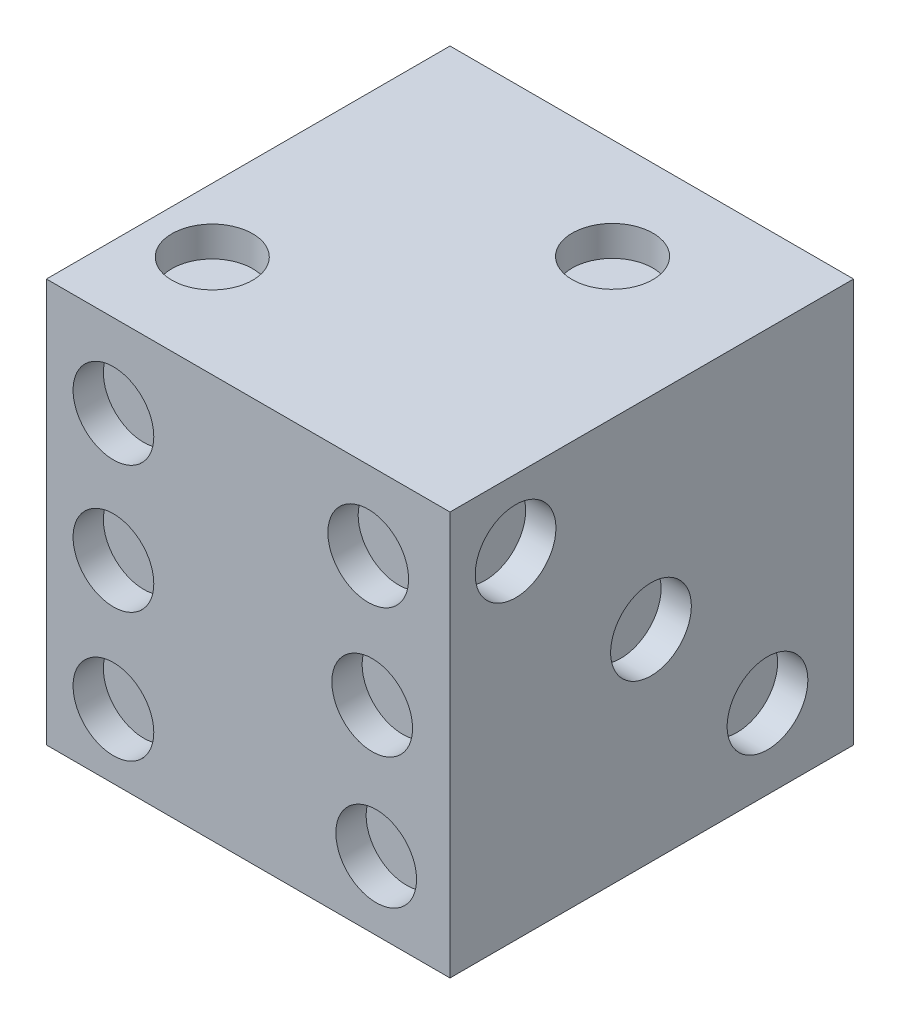
ISO-10303-21;
HEADER;
FILE_DESCRIPTION(('STEP AP214'),'2;1');
FILE_NAME('part.step','',(''),(''),'','','');
FILE_SCHEMA(('AUTOMOTIVE_DESIGN { 1 0 10303 214 1 1 1 1 }'));
ENDSEC;
DATA;
#1=APPLICATION_CONTEXT('core data for automotive mechanical design processes');
#2=APPLICATION_PROTOCOL_DEFINITION('international standard','automotive_design',2000,#1);
#3=PRODUCT_CONTEXT('',#1,'mechanical');
#4=PRODUCT('Part','Part','',(#3));
#5=PRODUCT_RELATED_PRODUCT_CATEGORY('part','',(#4));
#6=PRODUCT_DEFINITION_FORMATION('','',#4);
#7=PRODUCT_DEFINITION_CONTEXT('part definition',#1,'design');
#8=PRODUCT_DEFINITION('design','',#6,#7);
#9=PRODUCT_DEFINITION_SHAPE('','',#8);
#10=(LENGTH_UNIT() NAMED_UNIT(*) SI_UNIT(.MILLI.,.METRE.));
#11=(NAMED_UNIT(*) PLANE_ANGLE_UNIT() SI_UNIT($,.RADIAN.));
#12=(NAMED_UNIT(*) SI_UNIT($,.STERADIAN.) SOLID_ANGLE_UNIT());
#13=UNCERTAINTY_MEASURE_WITH_UNIT(LENGTH_MEASURE(1.E-05),#10,'distance_accuracy_value','');
#14=(GEOMETRIC_REPRESENTATION_CONTEXT(3) GLOBAL_UNCERTAINTY_ASSIGNED_CONTEXT((#13)) GLOBAL_UNIT_ASSIGNED_CONTEXT((#10,
#11,#12)) REPRESENTATION_CONTEXT('',''));
#15=CARTESIAN_POINT('',(0.,0.,0.));
#16=DIRECTION('',(0.,0.,1.));
#17=DIRECTION('',(1.,0.,0.));
#18=AXIS2_PLACEMENT_3D('',#15,#16,#17);
#19=CARTESIAN_POINT('',(-10.,20.,20.));
#20=DIRECTION('',(1.,0.,0.));
#21=DIRECTION('',(0.,0.,-1.));
#22=AXIS2_PLACEMENT_3D('',#19,#20,#21);
#23=PLANE('',#22);
#24=CARTESIAN_POINT('',(-10.,9.47677435584637,10.7372962402579));
#25=DIRECTION('',(-1.,0.,0.));
#26=DIRECTION('',(0.,0.,1.));
#27=AXIS2_PLACEMENT_3D('',#24,#25,#26);
#28=CIRCLE('',#27,2.);
#29=CARTESIAN_POINT('',(-10.,9.47677435584637,12.7372962402579));
#30=VERTEX_POINT('',#29);
#31=EDGE_CURVE('E213',#30,#30,#28,.T.);
#32=ORIENTED_EDGE('',*,*,#31,.F.);
#33=EDGE_LOOP('',(#32));
#34=FACE_BOUND('',#33,.T.);
#35=CARTESIAN_POINT('',(-10.,3.4279190696509,6.50648336929294));
#36=DIRECTION('',(-1.,0.,0.));
#37=DIRECTION('',(0.,0.,1.));
#38=AXIS2_PLACEMENT_3D('',#35,#36,#37);
#39=CIRCLE('',#38,2.);
#40=CARTESIAN_POINT('',(-10.,3.4279190696509,8.50648336929294));
#41=VERTEX_POINT('',#40);
#42=EDGE_CURVE('E208',#41,#41,#39,.T.);
#43=ORIENTED_EDGE('',*,*,#42,.F.);
#44=EDGE_LOOP('',(#43));
#45=FACE_BOUND('',#44,.T.);
#46=CARTESIAN_POINT('',(-10.,15.8511011072449,6.50648336929294));
#47=DIRECTION('',(-1.,0.,0.));
#48=DIRECTION('',(0.,0.,-1.));
#49=AXIS2_PLACEMENT_3D('',#46,#47,#48);
#50=CIRCLE('',#49,2.);
#51=CARTESIAN_POINT('',(-10.,15.8511011072449,4.50648336929294));
#52=VERTEX_POINT('',#51);
#53=EDGE_CURVE('E202',#52,#52,#50,.T.);
#54=ORIENTED_EDGE('',*,*,#53,.F.);
#55=EDGE_LOOP('',(#54));
#56=FACE_BOUND('',#55,.T.);
#57=CARTESIAN_POINT('',(-10.,15.8511011072449,15.6647192184352));
#58=DIRECTION('',(-1.,0.,0.));
#59=DIRECTION('',(0.,0.,-1.));
#60=AXIS2_PLACEMENT_3D('',#57,#58,#59);
#61=CIRCLE('',#60,2.);
#62=CARTESIAN_POINT('',(-10.,15.8511011072449,13.6647192184351));
#63=VERTEX_POINT('',#62);
#64=EDGE_CURVE('E195',#63,#63,#61,.T.);
#65=ORIENTED_EDGE('',*,*,#64,.F.);
#66=EDGE_LOOP('',(#65));
#67=FACE_BOUND('',#66,.T.);
#68=CARTESIAN_POINT('',(-10.,3.4279190696509,15.6647192184352));
#69=DIRECTION('',(-1.,0.,0.));
#70=DIRECTION('',(0.,0.,1.));
#71=AXIS2_PLACEMENT_3D('',#68,#69,#70);
#72=CIRCLE('',#71,2.);
#73=CARTESIAN_POINT('',(-10.,3.4279190696509,17.6647192184352));
#74=VERTEX_POINT('',#73);
#75=EDGE_CURVE('E189',#74,#74,#72,.T.);
#76=ORIENTED_EDGE('',*,*,#75,.F.);
#77=EDGE_LOOP('',(#76));
#78=FACE_BOUND('',#77,.T.);
#79=DIRECTION('',(0.,-1.,0.));
#80=VECTOR('',#79,1.);
#81=CARTESIAN_POINT('',(-10.,20.,0.));
#82=LINE('',#81,#80);
#83=CARTESIAN_POINT('',(-10.,20.,0.));
#84=VERTEX_POINT('',#83);
#85=CARTESIAN_POINT('',(-10.,0.,0.));
#86=VERTEX_POINT('',#85);
#87=EDGE_CURVE('E97',#84,#86,#82,.T.);
#88=ORIENTED_EDGE('',*,*,#87,.T.);
#89=DIRECTION('',(0.,0.,-1.));
#90=VECTOR('',#89,1.);
#91=CARTESIAN_POINT('',(-10.,0.,20.));
#92=LINE('',#91,#90);
#93=CARTESIAN_POINT('',(-10.,0.,20.));
#94=VERTEX_POINT('',#93);
#95=EDGE_CURVE('E11',#94,#86,#92,.T.);
#96=ORIENTED_EDGE('',*,*,#95,.F.);
#97=DIRECTION('',(0.,-1.,0.));
#98=VECTOR('',#97,1.);
#99=CARTESIAN_POINT('',(-10.,20.,20.));
#100=LINE('',#99,#98);
#101=CARTESIAN_POINT('',(-10.,20.,20.));
#102=VERTEX_POINT('',#101);
#103=EDGE_CURVE('E85',#102,#94,#100,.T.);
#104=ORIENTED_EDGE('',*,*,#103,.F.);
#105=DIRECTION('',(0.,0.,-1.));
#106=VECTOR('',#105,1.);
#107=CARTESIAN_POINT('',(-10.,20.,20.));
#108=LINE('',#107,#106);
#109=EDGE_CURVE('E93',#102,#84,#108,.T.);
#110=ORIENTED_EDGE('',*,*,#109,.T.);
#111=EDGE_LOOP('',(#88,#96,#104,#110));
#112=FACE_BOUND('',#111,.T.);
#113=ADVANCED_FACE('F34',(#34,#45,#56,#67,#78,#112),#23,.F.);
#114=CARTESIAN_POINT('',(-10.,0.,20.));
#115=DIRECTION('',(0.,1.,0.));
#116=DIRECTION('',(0.,0.,1.));
#117=AXIS2_PLACEMENT_3D('',#114,#115,#116);
#118=PLANE('',#117);
#119=CARTESIAN_POINT('',(-7.03112357133762,0.,13.2429627983441));
#120=DIRECTION('',(0.,-1.,0.));
#121=DIRECTION('',(0.,0.,-1.));
#122=AXIS2_PLACEMENT_3D('',#119,#120,#121);
#123=CIRCLE('',#122,2.);
#124=CARTESIAN_POINT('',(-7.03112357133762,0.,11.2429627983441));
#125=VERTEX_POINT('',#124);
#126=EDGE_CURVE('E172',#125,#125,#123,.T.);
#127=ORIENTED_EDGE('',*,*,#126,.F.);
#128=EDGE_LOOP('',(#127));
#129=FACE_BOUND('',#128,.T.);
#130=CARTESIAN_POINT('',(7.03112357133762,0.,13.2429627983441));
#131=DIRECTION('',(0.,-1.,0.));
#132=DIRECTION('',(0.,0.,1.));
#133=AXIS2_PLACEMENT_3D('',#130,#131,#132);
#134=CIRCLE('',#133,2.);
#135=CARTESIAN_POINT('',(7.03112357133762,0.,15.2429627983441));
#136=VERTEX_POINT('',#135);
#137=EDGE_CURVE('E166',#136,#136,#134,.T.);
#138=ORIENTED_EDGE('',*,*,#137,.F.);
#139=EDGE_LOOP('',(#138));
#140=FACE_BOUND('',#139,.T.);
#141=CARTESIAN_POINT('',(7.03112357133762,0.,4.4176472301416));
#142=DIRECTION('',(0.,-1.,0.));
#143=DIRECTION('',(0.,0.,1.));
#144=AXIS2_PLACEMENT_3D('',#141,#142,#143);
#145=CIRCLE('',#144,2.);
#146=CARTESIAN_POINT('',(7.03112357133762,0.,6.4176472301416));
#147=VERTEX_POINT('',#146);
#148=EDGE_CURVE('E159',#147,#147,#145,.T.);
#149=ORIENTED_EDGE('',*,*,#148,.F.);
#150=EDGE_LOOP('',(#149));
#151=FACE_BOUND('',#150,.T.);
#152=CARTESIAN_POINT('',(-7.03112357133762,0.,4.4176472301416));
#153=DIRECTION('',(0.,-1.,0.));
#154=DIRECTION('',(0.,0.,-1.));
#155=AXIS2_PLACEMENT_3D('',#152,#153,#154);
#156=CIRCLE('',#155,2.);
#157=CARTESIAN_POINT('',(-7.03112357133762,0.,2.4176472301416));
#158=VERTEX_POINT('',#157);
#159=EDGE_CURVE('E153',#158,#158,#156,.T.);
#160=ORIENTED_EDGE('',*,*,#159,.F.);
#161=EDGE_LOOP('',(#160));
#162=FACE_BOUND('',#161,.T.);
#163=DIRECTION('',(1.,0.,0.));
#164=VECTOR('',#163,1.);
#165=CARTESIAN_POINT('',(-10.,0.,0.));
#166=LINE('',#165,#164);
#167=CARTESIAN_POINT('',(10.,0.,0.));
#168=VERTEX_POINT('',#167);
#169=EDGE_CURVE('E89',#86,#168,#166,.T.);
#170=ORIENTED_EDGE('',*,*,#169,.T.);
#171=DIRECTION('',(0.,0.,-1.));
#172=VECTOR('',#171,1.);
#173=CARTESIAN_POINT('',(10.,0.,20.));
#174=LINE('',#173,#172);
#175=CARTESIAN_POINT('',(10.,0.,20.));
#176=VERTEX_POINT('',#175);
#177=EDGE_CURVE('E42',#176,#168,#174,.T.);
#178=ORIENTED_EDGE('',*,*,#177,.F.);
#179=DIRECTION('',(1.,0.,0.));
#180=VECTOR('',#179,1.);
#181=CARTESIAN_POINT('',(-10.,0.,20.));
#182=LINE('',#181,#180);
#183=EDGE_CURVE('E80',#94,#176,#182,.T.);
#184=ORIENTED_EDGE('',*,*,#183,.F.);
#185=ORIENTED_EDGE('',*,*,#95,.T.);
#186=EDGE_LOOP('',(#170,#178,#184,#185));
#187=FACE_BOUND('',#186,.T.);
#188=ADVANCED_FACE('F88',(#129,#140,#151,#162,#187),#118,.F.);
#189=CARTESIAN_POINT('',(10.,20.,20.));
#190=DIRECTION('',(-1.,0.,0.));
#191=DIRECTION('',(0.,0.,1.));
#192=AXIS2_PLACEMENT_3D('',#189,#190,#191);
#193=PLANE('',#192);
#194=CARTESIAN_POINT('',(10.,9.9860369719682,10.0393947627424));
#195=DIRECTION('',(1.,0.,0.));
#196=DIRECTION('',(0.,0.,-1.));
#197=AXIS2_PLACEMENT_3D('',#194,#195,#196);
#198=CIRCLE('',#197,2.);
#199=CARTESIAN_POINT('',(10.,9.9860369719682,8.0393947627424));
#200=VERTEX_POINT('',#199);
#201=EDGE_CURVE('E231',#200,#200,#198,.T.);
#202=ORIENTED_EDGE('',*,*,#201,.F.);
#203=EDGE_LOOP('',(#202));
#204=FACE_BOUND('',#203,.T.);
#205=CARTESIAN_POINT('',(10.,3.92594478392816,4.26530483262155));
#206=DIRECTION('',(1.,0.,0.));
#207=DIRECTION('',(0.,0.,-1.));
#208=AXIS2_PLACEMENT_3D('',#205,#206,#207);
#209=CIRCLE('',#208,2.);
#210=CARTESIAN_POINT('',(10.,3.92594478392816,2.26530483262155));
#211=VERTEX_POINT('',#210);
#212=EDGE_CURVE('E225',#211,#211,#209,.T.);
#213=ORIENTED_EDGE('',*,*,#212,.F.);
#214=EDGE_LOOP('',(#213));
#215=FACE_BOUND('',#214,.T.);
#216=CARTESIAN_POINT('',(10.,16.6913718629313,16.7498862351323));
#217=DIRECTION('',(1.,0.,0.));
#218=DIRECTION('',(0.,0.,-1.));
#219=AXIS2_PLACEMENT_3D('',#216,#217,#218);
#220=CIRCLE('',#219,2.);
#221=CARTESIAN_POINT('',(10.,16.6913718629313,14.7498862351323));
#222=VERTEX_POINT('',#221);
#223=EDGE_CURVE('E219',#222,#222,#220,.T.);
#224=ORIENTED_EDGE('',*,*,#223,.F.);
#225=EDGE_LOOP('',(#224));
#226=FACE_BOUND('',#225,.T.);
#227=DIRECTION('',(0.,1.,0.));
#228=VECTOR('',#227,1.);
#229=CARTESIAN_POINT('',(10.,20.,0.));
#230=LINE('',#229,#228);
#231=CARTESIAN_POINT('',(10.,20.,0.));
#232=VERTEX_POINT('',#231);
#233=EDGE_CURVE('E67',#168,#232,#230,.T.);
#234=ORIENTED_EDGE('',*,*,#233,.T.);
#235=DIRECTION('',(0.,0.,-1.));
#236=VECTOR('',#235,1.);
#237=CARTESIAN_POINT('',(10.,20.,20.));
#238=LINE('',#237,#236);
#239=CARTESIAN_POINT('',(10.,20.,20.));
#240=VERTEX_POINT('',#239);
#241=EDGE_CURVE('E90',#240,#232,#238,.T.);
#242=ORIENTED_EDGE('',*,*,#241,.F.);
#243=DIRECTION('',(0.,1.,0.));
#244=VECTOR('',#243,1.);
#245=CARTESIAN_POINT('',(10.,20.,20.));
#246=LINE('',#245,#244);
#247=EDGE_CURVE('E83',#176,#240,#246,.T.);
#248=ORIENTED_EDGE('',*,*,#247,.F.);
#249=ORIENTED_EDGE('',*,*,#177,.T.);
#250=EDGE_LOOP('',(#234,#242,#248,#249));
#251=FACE_BOUND('',#250,.T.);
#252=ADVANCED_FACE('F91',(#204,#215,#226,#251),#193,.F.);
#253=CARTESIAN_POINT('',(-10.,20.,20.));
#254=DIRECTION('',(0.,-1.,0.));
#255=DIRECTION('',(0.,0.,-1.));
#256=AXIS2_PLACEMENT_3D('',#253,#254,#255);
#257=PLANE('',#256);
#258=CARTESIAN_POINT('',(3.05628648112588,20.,5.00063172154341));
#259=DIRECTION('',(0.,1.,0.));
#260=DIRECTION('',(0.,0.,1.));
#261=AXIS2_PLACEMENT_3D('',#258,#259,#260);
#262=CIRCLE('',#261,2.);
#263=CARTESIAN_POINT('',(3.05628648112588,20.,7.00063172154341));
#264=VERTEX_POINT('',#263);
#265=EDGE_CURVE('E183',#264,#264,#262,.T.);
#266=ORIENTED_EDGE('',*,*,#265,.F.);
#267=EDGE_LOOP('',(#266));
#268=FACE_BOUND('',#267,.T.);
#269=CARTESIAN_POINT('',(-6.83621191535622,20.,14.9456896429569));
#270=DIRECTION('',(0.,1.,0.));
#271=DIRECTION('',(0.,0.,1.));
#272=AXIS2_PLACEMENT_3D('',#269,#270,#271);
#273=CIRCLE('',#272,2.);
#274=CARTESIAN_POINT('',(-6.83621191535622,20.,16.9456896429569));
#275=VERTEX_POINT('',#274);
#276=EDGE_CURVE('E177',#275,#275,#273,.T.);
#277=ORIENTED_EDGE('',*,*,#276,.F.);
#278=EDGE_LOOP('',(#277));
#279=FACE_BOUND('',#278,.T.);
#280=DIRECTION('',(-1.,0.,0.));
#281=VECTOR('',#280,1.);
#282=CARTESIAN_POINT('',(-10.,20.,0.));
#283=LINE('',#282,#281);
#284=EDGE_CURVE('E73',#232,#84,#283,.T.);
#285=ORIENTED_EDGE('',*,*,#284,.T.);
#286=ORIENTED_EDGE('',*,*,#109,.F.);
#287=DIRECTION('',(-1.,0.,0.));
#288=VECTOR('',#287,1.);
#289=CARTESIAN_POINT('',(-10.,20.,20.));
#290=LINE('',#289,#288);
#291=EDGE_CURVE('E50',#240,#102,#290,.T.);
#292=ORIENTED_EDGE('',*,*,#291,.F.);
#293=ORIENTED_EDGE('',*,*,#241,.T.);
#294=EDGE_LOOP('',(#285,#286,#292,#293));
#295=FACE_BOUND('',#294,.T.);
#296=ADVANCED_FACE('F105',(#268,#279,#295),#257,.F.);
#297=CARTESIAN_POINT('',(0.,0.,20.));
#298=DIRECTION('',(0.,0.,1.));
#299=DIRECTION('',(1.,0.,0.));
#300=AXIS2_PLACEMENT_3D('',#297,#298,#299);
#301=PLANE('',#300);
#302=CARTESIAN_POINT('',(-6.6796807731393,9.58568445602559,20.));
#303=DIRECTION('',(0.,0.,1.));
#304=DIRECTION('',(1.,0.,0.));
#305=AXIS2_PLACEMENT_3D('',#302,#303,#304);
#306=CIRCLE('',#305,2.);
#307=CARTESIAN_POINT('',(-4.6796807731393,9.58568445602559,20.));
#308=VERTEX_POINT('',#307);
#309=EDGE_CURVE('E148',#308,#308,#306,.T.);
#310=ORIENTED_EDGE('',*,*,#309,.F.);
#311=EDGE_LOOP('',(#310));
#312=FACE_BOUND('',#311,.T.);
#313=CARTESIAN_POINT('',(-6.6796807731393,15.8959742189904,20.));
#314=DIRECTION('',(0.,0.,1.));
#315=DIRECTION('',(1.,0.,0.));
#316=AXIS2_PLACEMENT_3D('',#313,#314,#315);
#317=CIRCLE('',#316,2.);
#318=CARTESIAN_POINT('',(-4.6796807731393,15.8959742189904,20.));
#319=VERTEX_POINT('',#318);
#320=EDGE_CURVE('E142',#319,#319,#317,.T.);
#321=ORIENTED_EDGE('',*,*,#320,.F.);
#322=EDGE_LOOP('',(#321));
#323=FACE_BOUND('',#322,.T.);
#324=CARTESIAN_POINT('',(5.94831499003633,16.0924056470403,20.));
#325=DIRECTION('',(0.,0.,1.));
#326=DIRECTION('',(-1.,0.,0.));
#327=AXIS2_PLACEMENT_3D('',#324,#325,#326);
#328=CIRCLE('',#327,2.);
#329=CARTESIAN_POINT('',(3.94831499003632,16.0924056470403,20.));
#330=VERTEX_POINT('',#329);
#331=EDGE_CURVE('E136',#330,#330,#328,.T.);
#332=ORIENTED_EDGE('',*,*,#331,.F.);
#333=EDGE_LOOP('',(#332));
#334=FACE_BOUND('',#333,.T.);
#335=CARTESIAN_POINT('',(6.14458356659566,9.78516888769529,20.));
#336=DIRECTION('',(0.,0.,1.));
#337=DIRECTION('',(-1.,0.,0.));
#338=AXIS2_PLACEMENT_3D('',#335,#336,#337);
#339=CIRCLE('',#338,2.);
#340=CARTESIAN_POINT('',(4.14458356659566,9.78516888769529,20.));
#341=VERTEX_POINT('',#340);
#342=EDGE_CURVE('E130',#341,#341,#339,.T.);
#343=ORIENTED_EDGE('',*,*,#342,.F.);
#344=EDGE_LOOP('',(#343));
#345=FACE_BOUND('',#344,.T.);
#346=CARTESIAN_POINT('',(6.34321475494008,3.4020078405191,20.));
#347=DIRECTION('',(0.,0.,1.));
#348=DIRECTION('',(-1.,0.,0.));
#349=AXIS2_PLACEMENT_3D('',#346,#347,#348);
#350=CIRCLE('',#349,2.);
#351=CARTESIAN_POINT('',(4.34321475494007,3.4020078405191,20.));
#352=VERTEX_POINT('',#351);
#353=EDGE_CURVE('E123',#352,#352,#350,.T.);
#354=ORIENTED_EDGE('',*,*,#353,.F.);
#355=EDGE_LOOP('',(#354));
#356=FACE_BOUND('',#355,.T.);
#357=CARTESIAN_POINT('',(-6.6796807731393,3.19943365425068,20.));
#358=DIRECTION('',(0.,0.,1.));
#359=DIRECTION('',(1.,0.,0.));
#360=AXIS2_PLACEMENT_3D('',#357,#358,#359);
#361=CIRCLE('',#360,2.);
#362=CARTESIAN_POINT('',(-4.6796807731393,3.19943365425068,20.));
#363=VERTEX_POINT('',#362);
#364=EDGE_CURVE('E117',#363,#363,#361,.T.);
#365=ORIENTED_EDGE('',*,*,#364,.F.);
#366=EDGE_LOOP('',(#365));
#367=FACE_BOUND('',#366,.T.);
#368=ORIENTED_EDGE('',*,*,#103,.T.);
#369=ORIENTED_EDGE('',*,*,#183,.T.);
#370=ORIENTED_EDGE('',*,*,#247,.T.);
#371=ORIENTED_EDGE('',*,*,#291,.T.);
#372=EDGE_LOOP('',(#368,#369,#370,#371));
#373=FACE_BOUND('',#372,.T.);
#374=ADVANCED_FACE('F81',(#312,#323,#334,#345,#356,#367,#373),#301,.T.);
#375=CARTESIAN_POINT('',(0.,0.,0.));
#376=DIRECTION('',(0.,0.,1.));
#377=DIRECTION('',(1.,0.,0.));
#378=AXIS2_PLACEMENT_3D('',#375,#376,#377);
#379=PLANE('',#378);
#380=CARTESIAN_POINT('',(0.,11.3874880955791,0.));
#381=DIRECTION('',(0.,0.,-1.));
#382=DIRECTION('',(-1.,0.,0.));
#383=AXIS2_PLACEMENT_3D('',#380,#381,#382);
#384=CIRCLE('',#383,2.);
#385=CARTESIAN_POINT('',(-2.,11.3874880955791,0.));
#386=VERTEX_POINT('',#385);
#387=EDGE_CURVE('E111',#386,#386,#384,.T.);
#388=ORIENTED_EDGE('',*,*,#387,.F.);
#389=EDGE_LOOP('',(#388));
#390=FACE_BOUND('',#389,.T.);
#391=ORIENTED_EDGE('',*,*,#87,.F.);
#392=ORIENTED_EDGE('',*,*,#284,.F.);
#393=ORIENTED_EDGE('',*,*,#233,.F.);
#394=ORIENTED_EDGE('',*,*,#169,.F.);
#395=EDGE_LOOP('',(#391,#392,#393,#394));
#396=FACE_BOUND('',#395,.T.);
#397=ADVANCED_FACE('F108',(#390,#396),#379,.F.);
#398=CARTESIAN_POINT('',(0.,11.3874880955791,1.5));
#399=DIRECTION('',(0.,0.,-1.));
#400=DIRECTION('',(-1.,0.,0.));
#401=AXIS2_PLACEMENT_3D('',#398,#399,#400);
#402=CYLINDRICAL_SURFACE('',#401,2.);
#403=CARTESIAN_POINT('',(0.,11.3874880955791,1.5));
#404=DIRECTION('',(0.,0.,-1.));
#405=DIRECTION('',(-1.,0.,0.));
#406=AXIS2_PLACEMENT_3D('',#403,#404,#405);
#407=CIRCLE('',#406,2.);
#408=CARTESIAN_POINT('',(-2.,11.3874880955791,1.5));
#409=VERTEX_POINT('',#408);
#410=EDGE_CURVE('E100',#409,#409,#407,.T.);
#411=ORIENTED_EDGE('',*,*,#410,.F.);
#412=EDGE_LOOP('',(#411));
#413=FACE_BOUND('',#412,.T.);
#414=ORIENTED_EDGE('',*,*,#387,.T.);
#415=EDGE_LOOP('',(#414));
#416=FACE_BOUND('',#415,.T.);
#417=ADVANCED_FACE('F399',(#413,#416),#402,.F.);
#418=CARTESIAN_POINT('',(0.,11.3874880955791,1.5));
#419=DIRECTION('',(0.,0.,-1.));
#420=DIRECTION('',(-1.,0.,0.));
#421=AXIS2_PLACEMENT_3D('',#418,#419,#420);
#422=PLANE('',#421);
#423=ORIENTED_EDGE('',*,*,#410,.T.);
#424=EDGE_LOOP('',(#423));
#425=FACE_BOUND('',#424,.T.);
#426=ADVANCED_FACE('F395',(#425),#422,.T.);
#427=CARTESIAN_POINT('',(-6.6796807731393,3.19943365425068,18.5));
#428=DIRECTION('',(0.,0.,1.));
#429=DIRECTION('',(1.,0.,0.));
#430=AXIS2_PLACEMENT_3D('',#427,#428,#429);
#431=CYLINDRICAL_SURFACE('',#430,2.);
#432=CARTESIAN_POINT('',(-6.6796807731393,3.19943365425068,18.5));
#433=DIRECTION('',(0.,0.,1.));
#434=DIRECTION('',(1.,0.,0.));
#435=AXIS2_PLACEMENT_3D('',#432,#433,#434);
#436=CIRCLE('',#435,2.);
#437=CARTESIAN_POINT('',(-4.6796807731393,3.19943365425068,18.5));
#438=VERTEX_POINT('',#437);
#439=EDGE_CURVE('E114',#438,#438,#436,.T.);
#440=ORIENTED_EDGE('',*,*,#439,.F.);
#441=EDGE_LOOP('',(#440));
#442=FACE_BOUND('',#441,.T.);
#443=ORIENTED_EDGE('',*,*,#364,.T.);
#444=EDGE_LOOP('',(#443));
#445=FACE_BOUND('',#444,.T.);
#446=ADVANCED_FACE('F391',(#442,#445),#431,.F.);
#447=CARTESIAN_POINT('',(-6.6796807731393,3.19943365425068,18.5));
#448=DIRECTION('',(0.,0.,1.));
#449=DIRECTION('',(1.,0.,0.));
#450=AXIS2_PLACEMENT_3D('',#447,#448,#449);
#451=PLANE('',#450);
#452=ORIENTED_EDGE('',*,*,#439,.T.);
#453=EDGE_LOOP('',(#452));
#454=FACE_BOUND('',#453,.T.);
#455=ADVANCED_FACE('F387',(#454),#451,.T.);
#456=CARTESIAN_POINT('',(6.34321475494008,3.4020078405191,18.5));
#457=DIRECTION('',(0.,0.,1.));
#458=DIRECTION('',(1.,0.,0.));
#459=AXIS2_PLACEMENT_3D('',#456,#457,#458);
#460=CYLINDRICAL_SURFACE('',#459,2.);
#461=CARTESIAN_POINT('',(6.34321475494008,3.4020078405191,18.5));
#462=DIRECTION('',(0.,0.,1.));
#463=DIRECTION('',(-1.,0.,0.));
#464=AXIS2_PLACEMENT_3D('',#461,#462,#463);
#465=CIRCLE('',#464,2.);
#466=CARTESIAN_POINT('',(4.34321475494007,3.4020078405191,18.5));
#467=VERTEX_POINT('',#466);
#468=EDGE_CURVE('E126',#467,#467,#465,.T.);
#469=ORIENTED_EDGE('',*,*,#468,.F.);
#470=EDGE_LOOP('',(#469));
#471=FACE_BOUND('',#470,.T.);
#472=ORIENTED_EDGE('',*,*,#353,.T.);
#473=EDGE_LOOP('',(#472));
#474=FACE_BOUND('',#473,.T.);
#475=ADVANCED_FACE('F383',(#471,#474),#460,.F.);
#476=CARTESIAN_POINT('',(6.34321475494008,3.4020078405191,18.5));
#477=DIRECTION('',(0.,0.,-1.));
#478=DIRECTION('',(-1.,0.,0.));
#479=AXIS2_PLACEMENT_3D('',#476,#477,#478);
#480=PLANE('',#479);
#481=ORIENTED_EDGE('',*,*,#468,.T.);
#482=EDGE_LOOP('',(#481));
#483=FACE_BOUND('',#482,.T.);
#484=ADVANCED_FACE('F379',(#483),#480,.F.);
#485=CARTESIAN_POINT('',(6.14458356659566,9.78516888769529,18.5));
#486=DIRECTION('',(0.,0.,1.));
#487=DIRECTION('',(1.,0.,0.));
#488=AXIS2_PLACEMENT_3D('',#485,#486,#487);
#489=CYLINDRICAL_SURFACE('',#488,2.);
#490=CARTESIAN_POINT('',(6.14458356659566,9.78516888769529,18.5));
#491=DIRECTION('',(0.,0.,1.));
#492=DIRECTION('',(-1.,0.,0.));
#493=AXIS2_PLACEMENT_3D('',#490,#491,#492);
#494=CIRCLE('',#493,2.);
#495=CARTESIAN_POINT('',(4.14458356659566,9.78516888769529,18.5));
#496=VERTEX_POINT('',#495);
#497=EDGE_CURVE('E133',#496,#496,#494,.T.);
#498=ORIENTED_EDGE('',*,*,#497,.F.);
#499=EDGE_LOOP('',(#498));
#500=FACE_BOUND('',#499,.T.);
#501=ORIENTED_EDGE('',*,*,#342,.T.);
#502=EDGE_LOOP('',(#501));
#503=FACE_BOUND('',#502,.T.);
#504=ADVANCED_FACE('F375',(#500,#503),#489,.F.);
#505=CARTESIAN_POINT('',(6.14458356659566,9.78516888769529,18.5));
#506=DIRECTION('',(0.,0.,-1.));
#507=DIRECTION('',(-1.,0.,0.));
#508=AXIS2_PLACEMENT_3D('',#505,#506,#507);
#509=PLANE('',#508);
#510=ORIENTED_EDGE('',*,*,#497,.T.);
#511=EDGE_LOOP('',(#510));
#512=FACE_BOUND('',#511,.T.);
#513=ADVANCED_FACE('F371',(#512),#509,.F.);
#514=CARTESIAN_POINT('',(5.94831499003633,16.0924056470403,18.5));
#515=DIRECTION('',(0.,0.,1.));
#516=DIRECTION('',(1.,0.,0.));
#517=AXIS2_PLACEMENT_3D('',#514,#515,#516);
#518=CYLINDRICAL_SURFACE('',#517,2.);
#519=CARTESIAN_POINT('',(5.94831499003633,16.0924056470403,18.5));
#520=DIRECTION('',(0.,0.,1.));
#521=DIRECTION('',(-1.,0.,0.));
#522=AXIS2_PLACEMENT_3D('',#519,#520,#521);
#523=CIRCLE('',#522,2.);
#524=CARTESIAN_POINT('',(3.94831499003632,16.0924056470403,18.5));
#525=VERTEX_POINT('',#524);
#526=EDGE_CURVE('E139',#525,#525,#523,.T.);
#527=ORIENTED_EDGE('',*,*,#526,.F.);
#528=EDGE_LOOP('',(#527));
#529=FACE_BOUND('',#528,.T.);
#530=ORIENTED_EDGE('',*,*,#331,.T.);
#531=EDGE_LOOP('',(#530));
#532=FACE_BOUND('',#531,.T.);
#533=ADVANCED_FACE('F367',(#529,#532),#518,.F.);
#534=CARTESIAN_POINT('',(5.94831499003633,16.0924056470403,18.5));
#535=DIRECTION('',(0.,0.,-1.));
#536=DIRECTION('',(-1.,0.,0.));
#537=AXIS2_PLACEMENT_3D('',#534,#535,#536);
#538=PLANE('',#537);
#539=ORIENTED_EDGE('',*,*,#526,.T.);
#540=EDGE_LOOP('',(#539));
#541=FACE_BOUND('',#540,.T.);
#542=ADVANCED_FACE('F363',(#541),#538,.F.);
#543=CARTESIAN_POINT('',(-6.6796807731393,15.8959742189904,18.5));
#544=DIRECTION('',(0.,0.,1.));
#545=DIRECTION('',(1.,0.,0.));
#546=AXIS2_PLACEMENT_3D('',#543,#544,#545);
#547=CYLINDRICAL_SURFACE('',#546,2.);
#548=CARTESIAN_POINT('',(-6.6796807731393,15.8959742189904,18.5));
#549=DIRECTION('',(0.,0.,1.));
#550=DIRECTION('',(1.,0.,0.));
#551=AXIS2_PLACEMENT_3D('',#548,#549,#550);
#552=CIRCLE('',#551,2.);
#553=CARTESIAN_POINT('',(-4.6796807731393,15.8959742189904,18.5));
#554=VERTEX_POINT('',#553);
#555=EDGE_CURVE('E145',#554,#554,#552,.T.);
#556=ORIENTED_EDGE('',*,*,#555,.F.);
#557=EDGE_LOOP('',(#556));
#558=FACE_BOUND('',#557,.T.);
#559=ORIENTED_EDGE('',*,*,#320,.T.);
#560=EDGE_LOOP('',(#559));
#561=FACE_BOUND('',#560,.T.);
#562=ADVANCED_FACE('F359',(#558,#561),#547,.F.);
#563=CARTESIAN_POINT('',(-6.6796807731393,15.8959742189904,18.5));
#564=DIRECTION('',(0.,0.,1.));
#565=DIRECTION('',(1.,0.,0.));
#566=AXIS2_PLACEMENT_3D('',#563,#564,#565);
#567=PLANE('',#566);
#568=ORIENTED_EDGE('',*,*,#555,.T.);
#569=EDGE_LOOP('',(#568));
#570=FACE_BOUND('',#569,.T.);
#571=ADVANCED_FACE('F355',(#570),#567,.T.);
#572=CARTESIAN_POINT('',(-6.6796807731393,9.58568445602559,18.5));
#573=DIRECTION('',(0.,0.,1.));
#574=DIRECTION('',(1.,0.,0.));
#575=AXIS2_PLACEMENT_3D('',#572,#573,#574);
#576=CYLINDRICAL_SURFACE('',#575,2.);
#577=CARTESIAN_POINT('',(-6.6796807731393,9.58568445602559,18.5));
#578=DIRECTION('',(0.,0.,1.));
#579=DIRECTION('',(1.,0.,0.));
#580=AXIS2_PLACEMENT_3D('',#577,#578,#579);
#581=CIRCLE('',#580,2.);
#582=CARTESIAN_POINT('',(-4.6796807731393,9.58568445602559,18.5));
#583=VERTEX_POINT('',#582);
#584=EDGE_CURVE('E120',#583,#583,#581,.T.);
#585=ORIENTED_EDGE('',*,*,#584,.F.);
#586=EDGE_LOOP('',(#585));
#587=FACE_BOUND('',#586,.T.);
#588=ORIENTED_EDGE('',*,*,#309,.T.);
#589=EDGE_LOOP('',(#588));
#590=FACE_BOUND('',#589,.T.);
#591=ADVANCED_FACE('F351',(#587,#590),#576,.F.);
#592=CARTESIAN_POINT('',(-6.6796807731393,9.58568445602559,18.5));
#593=DIRECTION('',(0.,0.,1.));
#594=DIRECTION('',(1.,0.,0.));
#595=AXIS2_PLACEMENT_3D('',#592,#593,#594);
#596=PLANE('',#595);
#597=ORIENTED_EDGE('',*,*,#584,.T.);
#598=EDGE_LOOP('',(#597));
#599=FACE_BOUND('',#598,.T.);
#600=ADVANCED_FACE('F347',(#599),#596,.T.);
#601=CARTESIAN_POINT('',(-7.03112357133762,1.5,4.4176472301416));
#602=DIRECTION('',(0.,-1.,0.));
#603=DIRECTION('',(0.,0.,-1.));
#604=AXIS2_PLACEMENT_3D('',#601,#602,#603);
#605=CYLINDRICAL_SURFACE('',#604,2.);
#606=CARTESIAN_POINT('',(-7.03112357133762,1.5,4.4176472301416));
#607=DIRECTION('',(0.,-1.,0.));
#608=DIRECTION('',(0.,0.,-1.));
#609=AXIS2_PLACEMENT_3D('',#606,#607,#608);
#610=CIRCLE('',#609,2.);
#611=CARTESIAN_POINT('',(-7.03112357133762,1.5,2.4176472301416));
#612=VERTEX_POINT('',#611);
#613=EDGE_CURVE('E127',#612,#612,#610,.T.);
#614=ORIENTED_EDGE('',*,*,#613,.F.);
#615=EDGE_LOOP('',(#614));
#616=FACE_BOUND('',#615,.T.);
#617=ORIENTED_EDGE('',*,*,#159,.T.);
#618=EDGE_LOOP('',(#617));
#619=FACE_BOUND('',#618,.T.);
#620=ADVANCED_FACE('F343',(#616,#619),#605,.F.);
#621=CARTESIAN_POINT('',(-7.03112357133762,1.5,4.4176472301416));
#622=DIRECTION('',(0.,-1.,0.));
#623=DIRECTION('',(0.,0.,-1.));
#624=AXIS2_PLACEMENT_3D('',#621,#622,#623);
#625=PLANE('',#624);
#626=ORIENTED_EDGE('',*,*,#613,.T.);
#627=EDGE_LOOP('',(#626));
#628=FACE_BOUND('',#627,.T.);
#629=ADVANCED_FACE('F339',(#628),#625,.T.);
#630=CARTESIAN_POINT('',(7.03112357133762,1.5,4.4176472301416));
#631=DIRECTION('',(0.,-1.,0.));
#632=DIRECTION('',(0.,0.,-1.));
#633=AXIS2_PLACEMENT_3D('',#630,#631,#632);
#634=CYLINDRICAL_SURFACE('',#633,2.);
#635=CARTESIAN_POINT('',(7.03112357133762,1.5,4.4176472301416));
#636=DIRECTION('',(0.,-1.,0.));
#637=DIRECTION('',(0.,0.,1.));
#638=AXIS2_PLACEMENT_3D('',#635,#636,#637);
#639=CIRCLE('',#638,2.);
#640=CARTESIAN_POINT('',(7.03112357133762,1.5,6.4176472301416));
#641=VERTEX_POINT('',#640);
#642=EDGE_CURVE('E162',#641,#641,#639,.T.);
#643=ORIENTED_EDGE('',*,*,#642,.F.);
#644=EDGE_LOOP('',(#643));
#645=FACE_BOUND('',#644,.T.);
#646=ORIENTED_EDGE('',*,*,#148,.T.);
#647=EDGE_LOOP('',(#646));
#648=FACE_BOUND('',#647,.T.);
#649=ADVANCED_FACE('F335',(#645,#648),#634,.F.);
#650=CARTESIAN_POINT('',(7.03112357133762,1.5,4.4176472301416));
#651=DIRECTION('',(0.,1.,0.));
#652=DIRECTION('',(0.,0.,1.));
#653=AXIS2_PLACEMENT_3D('',#650,#651,#652);
#654=PLANE('',#653);
#655=ORIENTED_EDGE('',*,*,#642,.T.);
#656=EDGE_LOOP('',(#655));
#657=FACE_BOUND('',#656,.T.);
#658=ADVANCED_FACE('F331',(#657),#654,.F.);
#659=CARTESIAN_POINT('',(7.03112357133762,1.5,13.2429627983441));
#660=DIRECTION('',(0.,-1.,0.));
#661=DIRECTION('',(0.,0.,-1.));
#662=AXIS2_PLACEMENT_3D('',#659,#660,#661);
#663=CYLINDRICAL_SURFACE('',#662,2.);
#664=CARTESIAN_POINT('',(7.03112357133762,1.5,13.2429627983441));
#665=DIRECTION('',(0.,-1.,0.));
#666=DIRECTION('',(0.,0.,1.));
#667=AXIS2_PLACEMENT_3D('',#664,#665,#666);
#668=CIRCLE('',#667,2.);
#669=CARTESIAN_POINT('',(7.03112357133762,1.5,15.2429627983441));
#670=VERTEX_POINT('',#669);
#671=EDGE_CURVE('E169',#670,#670,#668,.T.);
#672=ORIENTED_EDGE('',*,*,#671,.F.);
#673=EDGE_LOOP('',(#672));
#674=FACE_BOUND('',#673,.T.);
#675=ORIENTED_EDGE('',*,*,#137,.T.);
#676=EDGE_LOOP('',(#675));
#677=FACE_BOUND('',#676,.T.);
#678=ADVANCED_FACE('F327',(#674,#677),#663,.F.);
#679=CARTESIAN_POINT('',(7.03112357133762,1.5,13.2429627983441));
#680=DIRECTION('',(0.,1.,0.));
#681=DIRECTION('',(0.,0.,1.));
#682=AXIS2_PLACEMENT_3D('',#679,#680,#681);
#683=PLANE('',#682);
#684=ORIENTED_EDGE('',*,*,#671,.T.);
#685=EDGE_LOOP('',(#684));
#686=FACE_BOUND('',#685,.T.);
#687=ADVANCED_FACE('F323',(#686),#683,.F.);
#688=CARTESIAN_POINT('',(-7.03112357133762,1.5,13.2429627983441));
#689=DIRECTION('',(0.,-1.,0.));
#690=DIRECTION('',(0.,0.,-1.));
#691=AXIS2_PLACEMENT_3D('',#688,#689,#690);
#692=CYLINDRICAL_SURFACE('',#691,2.);
#693=CARTESIAN_POINT('',(-7.03112357133762,1.5,13.2429627983441));
#694=DIRECTION('',(0.,-1.,0.));
#695=DIRECTION('',(0.,0.,-1.));
#696=AXIS2_PLACEMENT_3D('',#693,#694,#695);
#697=CIRCLE('',#696,2.);
#698=CARTESIAN_POINT('',(-7.03112357133762,1.5,11.2429627983441));
#699=VERTEX_POINT('',#698);
#700=EDGE_CURVE('E156',#699,#699,#697,.T.);
#701=ORIENTED_EDGE('',*,*,#700,.F.);
#702=EDGE_LOOP('',(#701));
#703=FACE_BOUND('',#702,.T.);
#704=ORIENTED_EDGE('',*,*,#126,.T.);
#705=EDGE_LOOP('',(#704));
#706=FACE_BOUND('',#705,.T.);
#707=ADVANCED_FACE('F319',(#703,#706),#692,.F.);
#708=CARTESIAN_POINT('',(-7.03112357133762,1.5,13.2429627983441));
#709=DIRECTION('',(0.,-1.,0.));
#710=DIRECTION('',(0.,0.,-1.));
#711=AXIS2_PLACEMENT_3D('',#708,#709,#710);
#712=PLANE('',#711);
#713=ORIENTED_EDGE('',*,*,#700,.T.);
#714=EDGE_LOOP('',(#713));
#715=FACE_BOUND('',#714,.T.);
#716=ADVANCED_FACE('F315',(#715),#712,.T.);
#717=CARTESIAN_POINT('',(-6.83621191535622,18.5,14.9456896429569));
#718=DIRECTION('',(0.,1.,0.));
#719=DIRECTION('',(0.,0.,1.));
#720=AXIS2_PLACEMENT_3D('',#717,#718,#719);
#721=CYLINDRICAL_SURFACE('',#720,2.);
#722=CARTESIAN_POINT('',(-6.83621191535622,18.5,14.9456896429569));
#723=DIRECTION('',(0.,1.,0.));
#724=DIRECTION('',(0.,0.,1.));
#725=AXIS2_PLACEMENT_3D('',#722,#723,#724);
#726=CIRCLE('',#725,2.);
#727=CARTESIAN_POINT('',(-6.83621191535622,18.5,16.9456896429569));
#728=VERTEX_POINT('',#727);
#729=EDGE_CURVE('E163',#728,#728,#726,.T.);
#730=ORIENTED_EDGE('',*,*,#729,.F.);
#731=EDGE_LOOP('',(#730));
#732=FACE_BOUND('',#731,.T.);
#733=ORIENTED_EDGE('',*,*,#276,.T.);
#734=EDGE_LOOP('',(#733));
#735=FACE_BOUND('',#734,.T.);
#736=ADVANCED_FACE('F311',(#732,#735),#721,.F.);
#737=CARTESIAN_POINT('',(-6.83621191535622,18.5,14.9456896429569));
#738=DIRECTION('',(0.,1.,0.));
#739=DIRECTION('',(0.,0.,1.));
#740=AXIS2_PLACEMENT_3D('',#737,#738,#739);
#741=PLANE('',#740);
#742=ORIENTED_EDGE('',*,*,#729,.T.);
#743=EDGE_LOOP('',(#742));
#744=FACE_BOUND('',#743,.T.);
#745=ADVANCED_FACE('F307',(#744),#741,.T.);
#746=CARTESIAN_POINT('',(3.05628648112588,18.5,5.00063172154341));
#747=DIRECTION('',(0.,1.,0.));
#748=DIRECTION('',(0.,0.,1.));
#749=AXIS2_PLACEMENT_3D('',#746,#747,#748);
#750=CYLINDRICAL_SURFACE('',#749,2.);
#751=CARTESIAN_POINT('',(3.05628648112588,18.5,5.00063172154341));
#752=DIRECTION('',(0.,1.,0.));
#753=DIRECTION('',(0.,0.,1.));
#754=AXIS2_PLACEMENT_3D('',#751,#752,#753);
#755=CIRCLE('',#754,2.);
#756=CARTESIAN_POINT('',(3.05628648112588,18.5,7.00063172154341));
#757=VERTEX_POINT('',#756);
#758=EDGE_CURVE('E180',#757,#757,#755,.T.);
#759=ORIENTED_EDGE('',*,*,#758,.F.);
#760=EDGE_LOOP('',(#759));
#761=FACE_BOUND('',#760,.T.);
#762=ORIENTED_EDGE('',*,*,#265,.T.);
#763=EDGE_LOOP('',(#762));
#764=FACE_BOUND('',#763,.T.);
#765=ADVANCED_FACE('F299',(#761,#764),#750,.F.);
#766=CARTESIAN_POINT('',(3.05628648112588,18.5,5.00063172154341));
#767=DIRECTION('',(0.,1.,0.));
#768=DIRECTION('',(0.,0.,1.));
#769=AXIS2_PLACEMENT_3D('',#766,#767,#768);
#770=PLANE('',#769);
#771=ORIENTED_EDGE('',*,*,#758,.T.);
#772=EDGE_LOOP('',(#771));
#773=FACE_BOUND('',#772,.T.);
#774=ADVANCED_FACE('F289',(#773),#770,.T.);
#775=CARTESIAN_POINT('',(-8.5,3.4279190696509,15.6647192184352));
#776=DIRECTION('',(-1.,0.,0.));
#777=DIRECTION('',(0.,0.,1.));
#778=AXIS2_PLACEMENT_3D('',#775,#776,#777);
#779=CYLINDRICAL_SURFACE('',#778,2.);
#780=CARTESIAN_POINT('',(-8.5,3.4279190696509,15.6647192184352));
#781=DIRECTION('',(-1.,0.,0.));
#782=DIRECTION('',(0.,0.,1.));
#783=AXIS2_PLACEMENT_3D('',#780,#781,#782);
#784=CIRCLE('',#783,2.);
#785=CARTESIAN_POINT('',(-8.5,3.4279190696509,17.6647192184352));
#786=VERTEX_POINT('',#785);
#787=EDGE_CURVE('E186',#786,#786,#784,.T.);
#788=ORIENTED_EDGE('',*,*,#787,.F.);
#789=EDGE_LOOP('',(#788));
#790=FACE_BOUND('',#789,.T.);
#791=ORIENTED_EDGE('',*,*,#75,.T.);
#792=EDGE_LOOP('',(#791));
#793=FACE_BOUND('',#792,.T.);
#794=ADVANCED_FACE('F286',(#790,#793),#779,.F.);
#795=CARTESIAN_POINT('',(-8.5,3.4279190696509,15.6647192184352));
#796=DIRECTION('',(-1.,0.,0.));
#797=DIRECTION('',(0.,0.,1.));
#798=AXIS2_PLACEMENT_3D('',#795,#796,#797);
#799=PLANE('',#798);
#800=ORIENTED_EDGE('',*,*,#787,.T.);
#801=EDGE_LOOP('',(#800));
#802=FACE_BOUND('',#801,.T.);
#803=ADVANCED_FACE('F288',(#802),#799,.T.);
#804=CARTESIAN_POINT('',(-8.5,15.8511011072449,15.6647192184352));
#805=DIRECTION('',(-1.,0.,0.));
#806=DIRECTION('',(0.,0.,1.));
#807=AXIS2_PLACEMENT_3D('',#804,#805,#806);
#808=CYLINDRICAL_SURFACE('',#807,2.);
#809=CARTESIAN_POINT('',(-8.5,15.8511011072449,15.6647192184352));
#810=DIRECTION('',(-1.,0.,0.));
#811=DIRECTION('',(0.,0.,-1.));
#812=AXIS2_PLACEMENT_3D('',#809,#810,#811);
#813=CIRCLE('',#812,2.);
#814=CARTESIAN_POINT('',(-8.5,15.8511011072449,13.6647192184351));
#815=VERTEX_POINT('',#814);
#816=EDGE_CURVE('E198',#815,#815,#813,.T.);
#817=ORIENTED_EDGE('',*,*,#816,.F.);
#818=EDGE_LOOP('',(#817));
#819=FACE_BOUND('',#818,.T.);
#820=ORIENTED_EDGE('',*,*,#64,.T.);
#821=EDGE_LOOP('',(#820));
#822=FACE_BOUND('',#821,.T.);
#823=ADVANCED_FACE('F296',(#819,#822),#808,.F.);
#824=CARTESIAN_POINT('',(-8.5,15.8511011072449,15.6647192184352));
#825=DIRECTION('',(1.,0.,0.));
#826=DIRECTION('',(0.,0.,-1.));
#827=AXIS2_PLACEMENT_3D('',#824,#825,#826);
#828=PLANE('',#827);
#829=ORIENTED_EDGE('',*,*,#816,.T.);
#830=EDGE_LOOP('',(#829));
#831=FACE_BOUND('',#830,.T.);
#832=ADVANCED_FACE('F554',(#831),#828,.F.);
#833=CARTESIAN_POINT('',(-8.5,15.8511011072449,6.50648336929294));
#834=DIRECTION('',(-1.,0.,0.));
#835=DIRECTION('',(0.,0.,1.));
#836=AXIS2_PLACEMENT_3D('',#833,#834,#835);
#837=CYLINDRICAL_SURFACE('',#836,2.);
#838=CARTESIAN_POINT('',(-8.5,15.8511011072449,6.50648336929294));
#839=DIRECTION('',(-1.,0.,0.));
#840=DIRECTION('',(0.,0.,-1.));
#841=AXIS2_PLACEMENT_3D('',#838,#839,#840);
#842=CIRCLE('',#841,2.);
#843=CARTESIAN_POINT('',(-8.5,15.8511011072449,4.50648336929294));
#844=VERTEX_POINT('',#843);
#845=EDGE_CURVE('E205',#844,#844,#842,.T.);
#846=ORIENTED_EDGE('',*,*,#845,.F.);
#847=EDGE_LOOP('',(#846));
#848=FACE_BOUND('',#847,.T.);
#849=ORIENTED_EDGE('',*,*,#53,.T.);
#850=EDGE_LOOP('',(#849));
#851=FACE_BOUND('',#850,.T.);
#852=ADVANCED_FACE('F563',(#848,#851),#837,.F.);
#853=CARTESIAN_POINT('',(-8.5,15.8511011072449,6.50648336929294));
#854=DIRECTION('',(1.,0.,0.));
#855=DIRECTION('',(0.,0.,-1.));
#856=AXIS2_PLACEMENT_3D('',#853,#854,#855);
#857=PLANE('',#856);
#858=ORIENTED_EDGE('',*,*,#845,.T.);
#859=EDGE_LOOP('',(#858));
#860=FACE_BOUND('',#859,.T.);
#861=ADVANCED_FACE('F573',(#860),#857,.F.);
#862=CARTESIAN_POINT('',(-8.5,3.4279190696509,6.50648336929294));
#863=DIRECTION('',(-1.,0.,0.));
#864=DIRECTION('',(0.,0.,1.));
#865=AXIS2_PLACEMENT_3D('',#862,#863,#864);
#866=CYLINDRICAL_SURFACE('',#865,2.);
#867=CARTESIAN_POINT('',(-8.5,3.4279190696509,6.50648336929294));
#868=DIRECTION('',(-1.,0.,0.));
#869=DIRECTION('',(0.,0.,1.));
#870=AXIS2_PLACEMENT_3D('',#867,#868,#869);
#871=CIRCLE('',#870,2.);
#872=CARTESIAN_POINT('',(-8.5,3.4279190696509,8.50648336929294));
#873=VERTEX_POINT('',#872);
#874=EDGE_CURVE('E192',#873,#873,#871,.T.);
#875=ORIENTED_EDGE('',*,*,#874,.F.);
#876=EDGE_LOOP('',(#875));
#877=FACE_BOUND('',#876,.T.);
#878=ORIENTED_EDGE('',*,*,#42,.T.);
#879=EDGE_LOOP('',(#878));
#880=FACE_BOUND('',#879,.T.);
#881=ADVANCED_FACE('F583',(#877,#880),#866,.F.);
#882=CARTESIAN_POINT('',(-8.5,3.4279190696509,6.50648336929294));
#883=DIRECTION('',(-1.,0.,0.));
#884=DIRECTION('',(0.,0.,1.));
#885=AXIS2_PLACEMENT_3D('',#882,#883,#884);
#886=PLANE('',#885);
#887=ORIENTED_EDGE('',*,*,#874,.T.);
#888=EDGE_LOOP('',(#887));
#889=FACE_BOUND('',#888,.T.);
#890=ADVANCED_FACE('F593',(#889),#886,.T.);
#891=CARTESIAN_POINT('',(-8.5,9.47677435584637,10.7372962402579));
#892=DIRECTION('',(-1.,0.,0.));
#893=DIRECTION('',(0.,0.,1.));
#894=AXIS2_PLACEMENT_3D('',#891,#892,#893);
#895=CYLINDRICAL_SURFACE('',#894,2.);
#896=CARTESIAN_POINT('',(-8.5,9.47677435584637,10.7372962402579));
#897=DIRECTION('',(-1.,0.,0.));
#898=DIRECTION('',(0.,0.,1.));
#899=AXIS2_PLACEMENT_3D('',#896,#897,#898);
#900=CIRCLE('',#899,2.);
#901=CARTESIAN_POINT('',(-8.5,9.47677435584637,12.7372962402579));
#902=VERTEX_POINT('',#901);
#903=EDGE_CURVE('E199',#902,#902,#900,.T.);
#904=ORIENTED_EDGE('',*,*,#903,.F.);
#905=EDGE_LOOP('',(#904));
#906=FACE_BOUND('',#905,.T.);
#907=ORIENTED_EDGE('',*,*,#31,.T.);
#908=EDGE_LOOP('',(#907));
#909=FACE_BOUND('',#908,.T.);
#910=ADVANCED_FACE('F266',(#906,#909),#895,.F.);
#911=CARTESIAN_POINT('',(-8.5,9.47677435584637,10.7372962402579));
#912=DIRECTION('',(-1.,0.,0.));
#913=DIRECTION('',(0.,0.,1.));
#914=AXIS2_PLACEMENT_3D('',#911,#912,#913);
#915=PLANE('',#914);
#916=ORIENTED_EDGE('',*,*,#903,.T.);
#917=EDGE_LOOP('',(#916));
#918=FACE_BOUND('',#917,.T.);
#919=ADVANCED_FACE('F256',(#918),#915,.T.);
#920=CARTESIAN_POINT('',(8.5,16.6913718629313,16.7498862351323));
#921=DIRECTION('',(1.,0.,0.));
#922=DIRECTION('',(0.,0.,-1.));
#923=AXIS2_PLACEMENT_3D('',#920,#921,#922);
#924=CYLINDRICAL_SURFACE('',#923,2.);
#925=CARTESIAN_POINT('',(8.5,16.6913718629313,16.7498862351323));
#926=DIRECTION('',(1.,0.,0.));
#927=DIRECTION('',(0.,0.,-1.));
#928=AXIS2_PLACEMENT_3D('',#925,#926,#927);
#929=CIRCLE('',#928,2.);
#930=CARTESIAN_POINT('',(8.5,16.6913718629313,14.7498862351323));
#931=VERTEX_POINT('',#930);
#932=EDGE_CURVE('E216',#931,#931,#929,.T.);
#933=ORIENTED_EDGE('',*,*,#932,.F.);
#934=EDGE_LOOP('',(#933));
#935=FACE_BOUND('',#934,.T.);
#936=ORIENTED_EDGE('',*,*,#223,.T.);
#937=EDGE_LOOP('',(#936));
#938=FACE_BOUND('',#937,.T.);
#939=ADVANCED_FACE('F253',(#935,#938),#924,.F.);
#940=CARTESIAN_POINT('',(8.5,16.6913718629313,16.7498862351323));
#941=DIRECTION('',(1.,0.,0.));
#942=DIRECTION('',(0.,0.,-1.));
#943=AXIS2_PLACEMENT_3D('',#940,#941,#942);
#944=PLANE('',#943);
#945=ORIENTED_EDGE('',*,*,#932,.T.);
#946=EDGE_LOOP('',(#945));
#947=FACE_BOUND('',#946,.T.);
#948=ADVANCED_FACE('F255',(#947),#944,.T.);
#949=CARTESIAN_POINT('',(8.5,3.92594478392816,4.26530483262155));
#950=DIRECTION('',(1.,0.,0.));
#951=DIRECTION('',(0.,0.,-1.));
#952=AXIS2_PLACEMENT_3D('',#949,#950,#951);
#953=CYLINDRICAL_SURFACE('',#952,2.);
#954=CARTESIAN_POINT('',(8.5,3.92594478392816,4.26530483262155));
#955=DIRECTION('',(1.,0.,0.));
#956=DIRECTION('',(0.,0.,-1.));
#957=AXIS2_PLACEMENT_3D('',#954,#955,#956);
#958=CIRCLE('',#957,2.);
#959=CARTESIAN_POINT('',(8.5,3.92594478392816,2.26530483262155));
#960=VERTEX_POINT('',#959);
#961=EDGE_CURVE('E228',#960,#960,#958,.T.);
#962=ORIENTED_EDGE('',*,*,#961,.F.);
#963=EDGE_LOOP('',(#962));
#964=FACE_BOUND('',#963,.T.);
#965=ORIENTED_EDGE('',*,*,#212,.T.);
#966=EDGE_LOOP('',(#965));
#967=FACE_BOUND('',#966,.T.);
#968=ADVANCED_FACE('F263',(#964,#967),#953,.F.);
#969=CARTESIAN_POINT('',(8.5,3.92594478392816,4.26530483262155));
#970=DIRECTION('',(1.,0.,0.));
#971=DIRECTION('',(0.,0.,-1.));
#972=AXIS2_PLACEMENT_3D('',#969,#970,#971);
#973=PLANE('',#972);
#974=ORIENTED_EDGE('',*,*,#961,.T.);
#975=EDGE_LOOP('',(#974));
#976=FACE_BOUND('',#975,.T.);
#977=ADVANCED_FACE('F242',(#976),#973,.T.);
#978=CARTESIAN_POINT('',(8.5,9.9860369719682,10.0393947627424));
#979=DIRECTION('',(1.,0.,0.));
#980=DIRECTION('',(0.,0.,-1.));
#981=AXIS2_PLACEMENT_3D('',#978,#979,#980);
#982=CYLINDRICAL_SURFACE('',#981,2.);
#983=CARTESIAN_POINT('',(8.5,9.9860369719682,10.0393947627424));
#984=DIRECTION('',(1.,0.,0.));
#985=DIRECTION('',(0.,0.,-1.));
#986=AXIS2_PLACEMENT_3D('',#983,#984,#985);
#987=CIRCLE('',#986,2.);
#988=CARTESIAN_POINT('',(8.5,9.9860369719682,8.0393947627424));
#989=VERTEX_POINT('',#988);
#990=EDGE_CURVE('E222',#989,#989,#987,.T.);
#991=ORIENTED_EDGE('',*,*,#990,.F.);
#992=EDGE_LOOP('',(#991));
#993=FACE_BOUND('',#992,.T.);
#994=ORIENTED_EDGE('',*,*,#201,.T.);
#995=EDGE_LOOP('',(#994));
#996=FACE_BOUND('',#995,.T.);
#997=ADVANCED_FACE('F239',(#993,#996),#982,.F.);
#998=CARTESIAN_POINT('',(8.5,9.9860369719682,10.0393947627424));
#999=DIRECTION('',(1.,0.,0.));
#1000=DIRECTION('',(0.,0.,-1.));
#1001=AXIS2_PLACEMENT_3D('',#998,#999,#1000);
#1002=PLANE('',#1001);
#1003=ORIENTED_EDGE('',*,*,#990,.T.);
#1004=EDGE_LOOP('',(#1003));
#1005=FACE_BOUND('',#1004,.T.);
#1006=ADVANCED_FACE('F237',(#1005),#1002,.T.);
#1007=CLOSED_SHELL('',(#113,#188,#252,#296,#374,#397,#417,#426,#446,#455,#475,#484,#504,#513,
#533,#542,#562,#571,#591,#600,#620,#629,#649,#658,#678,#687,#707,#716,#736,#745,#765,#774,#794,
#803,#823,#832,#852,#861,#881,#890,#910,#919,#939,#948,#968,#977,#997,#1006));
#1008=MANIFOLD_SOLID_BREP('B2',#1007);
#1009=ADVANCED_BREP_SHAPE_REPRESENTATION('',(#18,#1008),#14);
#1010=SHAPE_DEFINITION_REPRESENTATION(#9,#1009);
ENDSEC;
END-ISO-10303-21;
